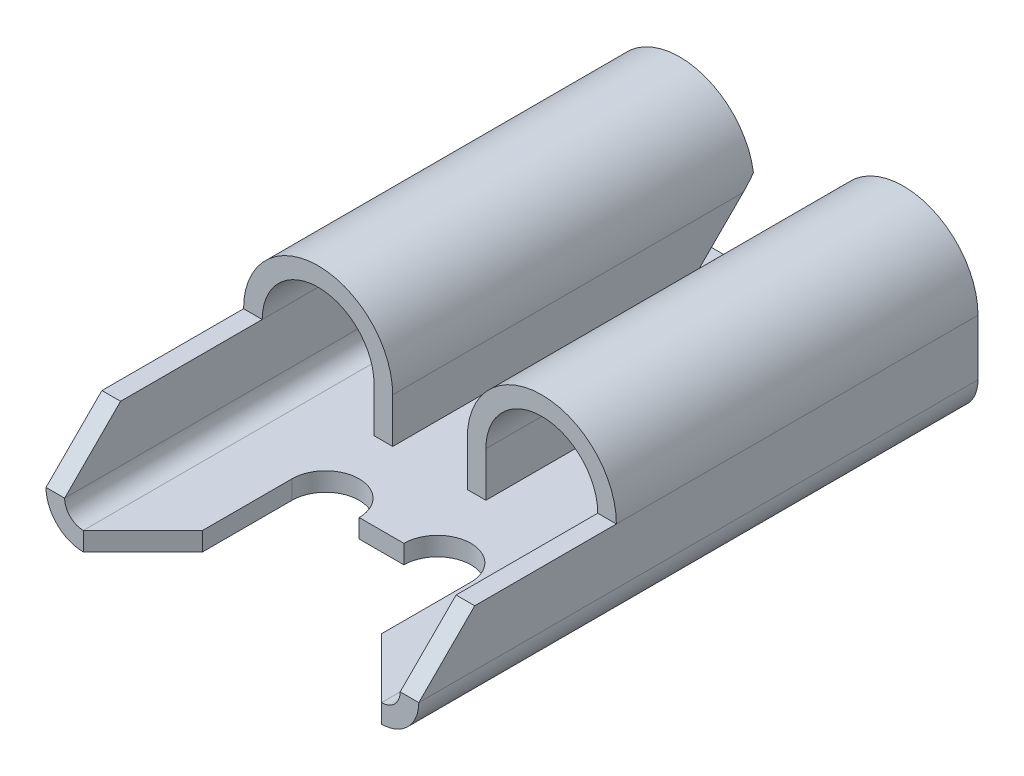
ISO-10303-21;
HEADER;
FILE_DESCRIPTION(('STEP AP214'),'2;1');
FILE_NAME('part.step','',(''),(''),'','','');
FILE_SCHEMA(('AUTOMOTIVE_DESIGN { 1 0 10303 214 1 1 1 1 }'));
ENDSEC;
DATA;
#1=APPLICATION_CONTEXT('core data for automotive mechanical design processes');
#2=APPLICATION_PROTOCOL_DEFINITION('international standard','automotive_design',2000,#1);
#3=PRODUCT_CONTEXT('',#1,'mechanical');
#4=PRODUCT('Part','Part','',(#3));
#5=PRODUCT_RELATED_PRODUCT_CATEGORY('part','',(#4));
#6=PRODUCT_DEFINITION_FORMATION('','',#4);
#7=PRODUCT_DEFINITION_CONTEXT('part definition',#1,'design');
#8=PRODUCT_DEFINITION('design','',#6,#7);
#9=PRODUCT_DEFINITION_SHAPE('','',#8);
#10=(LENGTH_UNIT() NAMED_UNIT(*) SI_UNIT(.MILLI.,.METRE.));
#11=(NAMED_UNIT(*) PLANE_ANGLE_UNIT() SI_UNIT($,.RADIAN.));
#12=(NAMED_UNIT(*) SI_UNIT($,.STERADIAN.) SOLID_ANGLE_UNIT());
#13=UNCERTAINTY_MEASURE_WITH_UNIT(LENGTH_MEASURE(1.E-05),#10,'distance_accuracy_value','');
#14=(GEOMETRIC_REPRESENTATION_CONTEXT(3) GLOBAL_UNCERTAINTY_ASSIGNED_CONTEXT((#13)) GLOBAL_UNIT_ASSIGNED_CONTEXT((#10,
#11,#12)) REPRESENTATION_CONTEXT('',''));
#15=CARTESIAN_POINT('',(0.,0.,0.));
#16=DIRECTION('',(0.,0.,1.));
#17=DIRECTION('',(1.,0.,0.));
#18=AXIS2_PLACEMENT_3D('',#15,#16,#17);
#19=CARTESIAN_POINT('',(-3.,2.5,-15.));
#20=DIRECTION('',(0.,0.,1.));
#21=DIRECTION('',(1.,0.,0.));
#22=AXIS2_PLACEMENT_3D('',#19,#20,#21);
#23=CYLINDRICAL_SURFACE('',#22,2.);
#24=DIRECTION('',(0.,0.,1.));
#25=VECTOR('',#24,1.);
#26=CARTESIAN_POINT('',(-1.,2.5,-15.));
#27=LINE('',#26,#25);
#28=CARTESIAN_POINT('',(-1.,2.5,-14.7));
#29=VERTEX_POINT('',#28);
#30=CARTESIAN_POINT('',(-1.,2.5,-5.3));
#31=VERTEX_POINT('',#30);
#32=EDGE_CURVE('E370',#29,#31,#27,.T.);
#33=ORIENTED_EDGE('',*,*,#32,.F.);
#34=CARTESIAN_POINT('',(-3.,2.5,-14.7));
#35=DIRECTION('',(0.,0.707106781186546,0.707106781186549));
#36=DIRECTION('',(0.,-0.707106781186549,0.707106781186546));
#37=AXIS2_PLACEMENT_3D('',#34,#35,#36);
#38=ELLIPSE('',#37,2.82842712474619,2.);
#39=CARTESIAN_POINT('',(-1.02262800667148,2.8,-15.));
#40=VERTEX_POINT('',#39);
#41=EDGE_CURVE('E438',#29,#40,#38,.T.);
#42=ORIENTED_EDGE('',*,*,#41,.T.);
#43=CARTESIAN_POINT('',(-3.,2.5,-15.));
#44=DIRECTION('',(0.,0.,1.));
#45=DIRECTION('',(1.,0.,0.));
#46=AXIS2_PLACEMENT_3D('',#43,#44,#45);
#47=CIRCLE('',#46,2.);
#48=CARTESIAN_POINT('',(-5.,2.5,-15.));
#49=VERTEX_POINT('',#48);
#50=EDGE_CURVE('E348',#40,#49,#47,.T.);
#51=ORIENTED_EDGE('',*,*,#50,.T.);
#52=DIRECTION('',(0.,0.,1.));
#53=VECTOR('',#52,1.);
#54=CARTESIAN_POINT('',(-5.,2.5,-15.));
#55=LINE('',#54,#53);
#56=CARTESIAN_POINT('',(-5.,2.5,-5.3));
#57=VERTEX_POINT('',#56);
#58=EDGE_CURVE('E367',#49,#57,#55,.T.);
#59=ORIENTED_EDGE('',*,*,#58,.T.);
#60=CARTESIAN_POINT('',(-3.,2.5,-5.3));
#61=DIRECTION('',(0.,0.,1.));
#62=DIRECTION('',(1.,0.,0.));
#63=AXIS2_PLACEMENT_3D('',#60,#61,#62);
#64=CIRCLE('',#63,2.);
#65=EDGE_CURVE('E258',#57,#31,#64,.F.);
#66=ORIENTED_EDGE('',*,*,#65,.T.);
#67=EDGE_LOOP('',(#33,#42,#51,#59,#66));
#68=FACE_BOUND('',#67,.T.);
#69=ADVANCED_FACE('F34',(#68),#23,.T.);
#70=CARTESIAN_POINT('',(-3.,2.5,-15.));
#71=DIRECTION('',(0.,0.,1.));
#72=DIRECTION('',(1.,0.,0.));
#73=AXIS2_PLACEMENT_3D('',#70,#71,#72);
#74=CYLINDRICAL_SURFACE('',#73,1.5);
#75=CARTESIAN_POINT('',(-3.,2.5,-15.));
#76=DIRECTION('',(0.,0.,-1.));
#77=DIRECTION('',(1.,0.,0.));
#78=AXIS2_PLACEMENT_3D('',#75,#76,#77);
#79=CIRCLE('',#78,1.5);
#80=CARTESIAN_POINT('',(-4.5,2.5,-15.));
#81=VERTEX_POINT('',#80);
#82=CARTESIAN_POINT('',(-1.53030615433009,2.8,-15.));
#83=VERTEX_POINT('',#82);
#84=EDGE_CURVE('E346',#81,#83,#79,.T.);
#85=ORIENTED_EDGE('',*,*,#84,.T.);
#86=CARTESIAN_POINT('',(-3.,2.5,-14.7));
#87=DIRECTION('',(0.,0.707106781186546,0.707106781186549));
#88=DIRECTION('',(0.,-0.707106781186549,0.707106781186546));
#89=AXIS2_PLACEMENT_3D('',#86,#87,#88);
#90=ELLIPSE('',#89,2.12132034355964,1.5);
#91=CARTESIAN_POINT('',(-1.5,2.5,-14.7));
#92=VERTEX_POINT('',#91);
#93=EDGE_CURVE('E237',#83,#92,#90,.F.);
#94=ORIENTED_EDGE('',*,*,#93,.T.);
#95=DIRECTION('',(0.,0.,1.));
#96=VECTOR('',#95,1.);
#97=CARTESIAN_POINT('',(-1.5,2.5,-15.));
#98=LINE('',#97,#96);
#99=CARTESIAN_POINT('',(-1.5,2.5,-5.3));
#100=VERTEX_POINT('',#99);
#101=EDGE_CURVE('E229',#92,#100,#98,.T.);
#102=ORIENTED_EDGE('',*,*,#101,.T.);
#103=CARTESIAN_POINT('',(-3.,2.5,-5.3));
#104=DIRECTION('',(0.,0.,1.));
#105=DIRECTION('',(1.,0.,0.));
#106=AXIS2_PLACEMENT_3D('',#103,#104,#105);
#107=CIRCLE('',#106,1.5);
#108=CARTESIAN_POINT('',(-4.5,2.5,-5.3));
#109=VERTEX_POINT('',#108);
#110=EDGE_CURVE('E234',#100,#109,#107,.T.);
#111=ORIENTED_EDGE('',*,*,#110,.T.);
#112=DIRECTION('',(0.,0.,1.));
#113=VECTOR('',#112,1.);
#114=CARTESIAN_POINT('',(-4.5,2.5,-15.));
#115=LINE('',#114,#113);
#116=EDGE_CURVE('E241',#81,#109,#115,.T.);
#117=ORIENTED_EDGE('',*,*,#116,.F.);
#118=EDGE_LOOP('',(#85,#94,#102,#111,#117));
#119=FACE_BOUND('',#118,.T.);
#120=ADVANCED_FACE('F232',(#119),#74,.F.);
#121=CARTESIAN_POINT('',(3.,2.5,-15.));
#122=DIRECTION('',(0.,0.,1.));
#123=DIRECTION('',(1.,0.,0.));
#124=AXIS2_PLACEMENT_3D('',#121,#122,#123);
#125=CYLINDRICAL_SURFACE('',#124,1.5);
#126=DIRECTION('',(0.,0.,1.));
#127=VECTOR('',#126,1.);
#128=CARTESIAN_POINT('',(1.5,2.5,-15.));
#129=LINE('',#128,#127);
#130=CARTESIAN_POINT('',(1.5,2.5,-14.7));
#131=VERTEX_POINT('',#130);
#132=CARTESIAN_POINT('',(1.5,2.5,-5.3));
#133=VERTEX_POINT('',#132);
#134=EDGE_CURVE('E391',#131,#133,#129,.T.);
#135=ORIENTED_EDGE('',*,*,#134,.F.);
#136=CARTESIAN_POINT('',(3.,2.5,-14.7));
#137=DIRECTION('',(0.,0.707106781186546,0.707106781186549));
#138=DIRECTION('',(0.,-0.707106781186549,0.707106781186546));
#139=AXIS2_PLACEMENT_3D('',#136,#137,#138);
#140=ELLIPSE('',#139,2.12132034355964,1.5);
#141=CARTESIAN_POINT('',(1.53030615433009,2.8,-15.));
#142=VERTEX_POINT('',#141);
#143=EDGE_CURVE('E423',#131,#142,#140,.F.);
#144=ORIENTED_EDGE('',*,*,#143,.T.);
#145=CARTESIAN_POINT('',(3.,2.5,-15.));
#146=DIRECTION('',(0.,0.,-1.));
#147=DIRECTION('',(-1.,0.,0.));
#148=AXIS2_PLACEMENT_3D('',#145,#146,#147);
#149=CIRCLE('',#148,1.5);
#150=CARTESIAN_POINT('',(4.5,2.5,-15.));
#151=VERTEX_POINT('',#150);
#152=EDGE_CURVE('E330',#142,#151,#149,.T.);
#153=ORIENTED_EDGE('',*,*,#152,.T.);
#154=DIRECTION('',(0.,0.,1.));
#155=VECTOR('',#154,1.);
#156=CARTESIAN_POINT('',(4.5,2.5,-15.));
#157=LINE('',#156,#155);
#158=CARTESIAN_POINT('',(4.5,2.5,-5.3));
#159=VERTEX_POINT('',#158);
#160=EDGE_CURVE('E388',#151,#159,#157,.T.);
#161=ORIENTED_EDGE('',*,*,#160,.T.);
#162=CARTESIAN_POINT('',(3.,2.5,-5.3));
#163=DIRECTION('',(0.,0.,1.));
#164=DIRECTION('',(1.,0.,0.));
#165=AXIS2_PLACEMENT_3D('',#162,#163,#164);
#166=CIRCLE('',#165,1.5);
#167=EDGE_CURVE('E259',#159,#133,#166,.T.);
#168=ORIENTED_EDGE('',*,*,#167,.T.);
#169=EDGE_LOOP('',(#135,#144,#153,#161,#168));
#170=FACE_BOUND('',#169,.T.);
#171=ADVANCED_FACE('F551',(#170),#125,.F.);
#172=CARTESIAN_POINT('',(3.,2.5,-15.));
#173=DIRECTION('',(0.,0.,1.));
#174=DIRECTION('',(1.,0.,0.));
#175=AXIS2_PLACEMENT_3D('',#172,#173,#174);
#176=CYLINDRICAL_SURFACE('',#175,2.);
#177=CARTESIAN_POINT('',(3.,2.5,-15.));
#178=DIRECTION('',(0.,0.,1.));
#179=DIRECTION('',(-1.,0.,0.));
#180=AXIS2_PLACEMENT_3D('',#177,#178,#179);
#181=CIRCLE('',#180,2.);
#182=CARTESIAN_POINT('',(5.,2.5,-15.));
#183=VERTEX_POINT('',#182);
#184=CARTESIAN_POINT('',(1.02262800667148,2.8,-15.));
#185=VERTEX_POINT('',#184);
#186=EDGE_CURVE('E327',#183,#185,#181,.T.);
#187=ORIENTED_EDGE('',*,*,#186,.T.);
#188=CARTESIAN_POINT('',(3.,2.5,-14.7));
#189=DIRECTION('',(0.,0.707106781186546,0.707106781186549));
#190=DIRECTION('',(0.,-0.707106781186549,0.707106781186546));
#191=AXIS2_PLACEMENT_3D('',#188,#189,#190);
#192=ELLIPSE('',#191,2.82842712474619,2.);
#193=CARTESIAN_POINT('',(1.,2.5,-14.7));
#194=VERTEX_POINT('',#193);
#195=EDGE_CURVE('E429',#185,#194,#192,.T.);
#196=ORIENTED_EDGE('',*,*,#195,.T.);
#197=DIRECTION('',(0.,0.,1.));
#198=VECTOR('',#197,1.);
#199=CARTESIAN_POINT('',(1.,2.5,-15.));
#200=LINE('',#199,#198);
#201=CARTESIAN_POINT('',(1.,2.5,-5.3));
#202=VERTEX_POINT('',#201);
#203=EDGE_CURVE('E397',#194,#202,#200,.T.);
#204=ORIENTED_EDGE('',*,*,#203,.T.);
#205=CARTESIAN_POINT('',(3.,2.5,-5.3));
#206=DIRECTION('',(0.,0.,1.));
#207=DIRECTION('',(1.,0.,0.));
#208=AXIS2_PLACEMENT_3D('',#205,#206,#207);
#209=CIRCLE('',#208,2.);
#210=CARTESIAN_POINT('',(5.,2.5,-5.3));
#211=VERTEX_POINT('',#210);
#212=EDGE_CURVE('E415',#202,#211,#209,.F.);
#213=ORIENTED_EDGE('',*,*,#212,.T.);
#214=DIRECTION('',(0.,0.,1.));
#215=VECTOR('',#214,1.);
#216=CARTESIAN_POINT('',(5.,2.5,-15.));
#217=LINE('',#216,#215);
#218=EDGE_CURVE('E399',#183,#211,#217,.T.);
#219=ORIENTED_EDGE('',*,*,#218,.F.);
#220=EDGE_LOOP('',(#187,#196,#204,#213,#219));
#221=FACE_BOUND('',#220,.T.);
#222=ADVANCED_FACE('F584',(#221),#176,.T.);
#223=CARTESIAN_POINT('',(-4.,0.999999999999999,0.));
#224=DIRECTION('',(0.,0.,-1.));
#225=DIRECTION('',(-1.,0.,0.));
#226=AXIS2_PLACEMENT_3D('',#223,#224,#225);
#227=PLANE('',#226);
#228=CARTESIAN_POINT('',(4.,0.999999999999999,0.));
#229=DIRECTION('',(0.,0.,1.));
#230=DIRECTION('',(1.,0.,0.));
#231=AXIS2_PLACEMENT_3D('',#228,#229,#230);
#232=CIRCLE('',#231,1.);
#233=CARTESIAN_POINT('',(4.,0.,0.));
#234=VERTEX_POINT('',#233);
#235=CARTESIAN_POINT('',(5.,1.00000000000001,0.));
#236=VERTEX_POINT('',#235);
#237=EDGE_CURVE('E356',#234,#236,#232,.T.);
#238=ORIENTED_EDGE('',*,*,#237,.T.);
#239=DIRECTION('',(-1.,0.,0.));
#240=VECTOR('',#239,1.);
#241=CARTESIAN_POINT('',(-4.,1.,0.));
#242=LINE('',#241,#240);
#243=CARTESIAN_POINT('',(4.5,1.,0.));
#244=VERTEX_POINT('',#243);
#245=EDGE_CURVE('E443',#236,#244,#242,.T.);
#246=ORIENTED_EDGE('',*,*,#245,.T.);
#247=CARTESIAN_POINT('',(4.,0.999999999999999,0.));
#248=DIRECTION('',(0.,0.,-1.));
#249=DIRECTION('',(1.,0.,0.));
#250=AXIS2_PLACEMENT_3D('',#247,#248,#249);
#251=CIRCLE('',#250,0.5);
#252=CARTESIAN_POINT('',(4.,0.5,0.));
#253=VERTEX_POINT('',#252);
#254=EDGE_CURVE('E359',#244,#253,#251,.T.);
#255=ORIENTED_EDGE('',*,*,#254,.T.);
#256=DIRECTION('',(0.,-1.,0.));
#257=VECTOR('',#256,1.);
#258=CARTESIAN_POINT('',(4.,0.999999999999998,0.));
#259=LINE('',#258,#257);
#260=EDGE_CURVE('E412',#253,#234,#259,.T.);
#261=ORIENTED_EDGE('',*,*,#260,.T.);
#262=EDGE_LOOP('',(#238,#246,#255,#261));
#263=FACE_BOUND('',#262,.T.);
#264=ADVANCED_FACE('F491',(#263),#227,.F.);
#265=CARTESIAN_POINT('',(-4.,0.999999999999999,-15.));
#266=DIRECTION('',(0.,0.,1.));
#267=DIRECTION('',(1.,0.,0.));
#268=AXIS2_PLACEMENT_3D('',#265,#266,#267);
#269=CYLINDRICAL_SURFACE('',#268,1.);
#270=CARTESIAN_POINT('',(-4.,0.999999999999999,0.));
#271=DIRECTION('',(0.,0.,1.));
#272=DIRECTION('',(-1.,0.,0.));
#273=AXIS2_PLACEMENT_3D('',#270,#271,#272);
#274=CIRCLE('',#273,1.);
#275=CARTESIAN_POINT('',(-5.,1.00000000000001,0.));
#276=VERTEX_POINT('',#275);
#277=CARTESIAN_POINT('',(-4.,0.,0.));
#278=VERTEX_POINT('',#277);
#279=EDGE_CURVE('E314',#276,#278,#274,.T.);
#280=ORIENTED_EDGE('',*,*,#279,.F.);
#281=DIRECTION('',(0.,0.,1.));
#282=VECTOR('',#281,1.);
#283=CARTESIAN_POINT('',(-5.,1.00000000000001,-15.));
#284=LINE('',#283,#282);
#285=CARTESIAN_POINT('',(-5.,1.00000000000001,-15.));
#286=VERTEX_POINT('',#285);
#287=EDGE_CURVE('E364',#286,#276,#284,.T.);
#288=ORIENTED_EDGE('',*,*,#287,.F.);
#289=CARTESIAN_POINT('',(-4.,0.999999999999999,-15.));
#290=DIRECTION('',(0.,0.,1.));
#291=DIRECTION('',(-1.,0.,0.));
#292=AXIS2_PLACEMENT_3D('',#289,#290,#291);
#293=CIRCLE('',#292,1.);
#294=CARTESIAN_POINT('',(-3.99999999999999,0.,-15.));
#295=VERTEX_POINT('',#294);
#296=EDGE_CURVE('E315',#286,#295,#293,.T.);
#297=ORIENTED_EDGE('',*,*,#296,.T.);
#298=DIRECTION('',(0.,0.,1.));
#299=VECTOR('',#298,1.);
#300=CARTESIAN_POINT('',(-3.99999999999999,0.,-15.));
#301=LINE('',#300,#299);
#302=EDGE_CURVE('E353',#295,#278,#301,.T.);
#303=ORIENTED_EDGE('',*,*,#302,.T.);
#304=EDGE_LOOP('',(#280,#288,#297,#303));
#305=FACE_BOUND('',#304,.T.);
#306=ADVANCED_FACE('F467',(#305),#269,.T.);
#307=CARTESIAN_POINT('',(-5.,1.00000000000001,-15.));
#308=DIRECTION('',(-1.,0.,0.));
#309=DIRECTION('',(0.,0.,1.));
#310=AXIS2_PLACEMENT_3D('',#307,#308,#309);
#311=PLANE('',#310);
#312=ORIENTED_EDGE('',*,*,#287,.T.);
#313=DIRECTION('',(0.,-0.707106781186546,0.707106781186549));
#314=VECTOR('',#313,1.);
#315=CARTESIAN_POINT('',(-5.,8.5,-7.50000000000003));
#316=LINE('',#315,#314);
#317=CARTESIAN_POINT('',(-5.,2.5,-1.50000000000001));
#318=VERTEX_POINT('',#317);
#319=EDGE_CURVE('E56',#276,#318,#316,.F.);
#320=ORIENTED_EDGE('',*,*,#319,.T.);
#321=DIRECTION('',(0.,0.,-1.));
#322=VECTOR('',#321,1.);
#323=CARTESIAN_POINT('',(-5.,2.5,0.));
#324=LINE('',#323,#322);
#325=EDGE_CURVE('E647',#318,#57,#324,.T.);
#326=ORIENTED_EDGE('',*,*,#325,.T.);
#327=ORIENTED_EDGE('',*,*,#58,.F.);
#328=DIRECTION('',(0.,-1.,0.));
#329=VECTOR('',#328,1.);
#330=CARTESIAN_POINT('',(-5.,1.00000000000001,-15.));
#331=LINE('',#330,#329);
#332=EDGE_CURVE('E350',#49,#286,#331,.T.);
#333=ORIENTED_EDGE('',*,*,#332,.T.);
#334=EDGE_LOOP('',(#312,#320,#326,#327,#333));
#335=FACE_BOUND('',#334,.T.);
#336=ADVANCED_FACE('F462',(#335),#311,.T.);
#337=CARTESIAN_POINT('',(-1.,2.5,-15.));
#338=DIRECTION('',(1.,0.,0.));
#339=DIRECTION('',(0.,1.,0.));
#340=AXIS2_PLACEMENT_3D('',#337,#338,#339);
#341=PLANE('',#340);
#342=DIRECTION('',(0.,0.,1.));
#343=VECTOR('',#342,1.);
#344=CARTESIAN_POINT('',(-1.,1.3,-15.));
#345=LINE('',#344,#343);
#346=CARTESIAN_POINT('',(-1.,1.3,-13.5));
#347=VERTEX_POINT('',#346);
#348=CARTESIAN_POINT('',(-1.,1.3,-5.3));
#349=VERTEX_POINT('',#348);
#350=EDGE_CURVE('E372',#347,#349,#345,.T.);
#351=ORIENTED_EDGE('',*,*,#350,.F.);
#352=DIRECTION('',(0.,-0.707106781186549,0.707106781186546));
#353=VECTOR('',#352,1.);
#354=CARTESIAN_POINT('',(-1.,2.65,-14.85));
#355=LINE('',#354,#353);
#356=EDGE_CURVE('E436',#347,#29,#355,.F.);
#357=ORIENTED_EDGE('',*,*,#356,.T.);
#358=ORIENTED_EDGE('',*,*,#32,.T.);
#359=DIRECTION('',(0.,1.,0.));
#360=VECTOR('',#359,1.);
#361=CARTESIAN_POINT('',(-1.,2.5,-5.3));
#362=LINE('',#361,#360);
#363=EDGE_CURVE('E644',#349,#31,#362,.T.);
#364=ORIENTED_EDGE('',*,*,#363,.F.);
#365=EDGE_LOOP('',(#351,#357,#358,#364));
#366=FACE_BOUND('',#365,.T.);
#367=ADVANCED_FACE('F557',(#366),#341,.T.);
#368=CARTESIAN_POINT('',(-1.5,1.3,-15.));
#369=DIRECTION('',(0.,-1.,0.));
#370=DIRECTION('',(0.,0.,-1.));
#371=AXIS2_PLACEMENT_3D('',#368,#369,#370);
#372=PLANE('',#371);
#373=DIRECTION('',(0.,0.,1.));
#374=VECTOR('',#373,1.);
#375=CARTESIAN_POINT('',(-1.5,1.3,-15.));
#376=LINE('',#375,#374);
#377=CARTESIAN_POINT('',(-1.5,1.3,-13.5));
#378=VERTEX_POINT('',#377);
#379=CARTESIAN_POINT('',(-1.5,1.3,-5.3));
#380=VERTEX_POINT('',#379);
#381=EDGE_CURVE('E240',#378,#380,#376,.T.);
#382=ORIENTED_EDGE('',*,*,#381,.F.);
#383=DIRECTION('',(1.,0.,0.));
#384=VECTOR('',#383,1.);
#385=CARTESIAN_POINT('',(-1.5,1.3,-13.5));
#386=LINE('',#385,#384);
#387=EDGE_CURVE('E433',#378,#347,#386,.T.);
#388=ORIENTED_EDGE('',*,*,#387,.T.);
#389=ORIENTED_EDGE('',*,*,#350,.T.);
#390=DIRECTION('',(1.,0.,0.));
#391=VECTOR('',#390,1.);
#392=CARTESIAN_POINT('',(-1.5,1.3,-5.3));
#393=LINE('',#392,#391);
#394=EDGE_CURVE('E641',#380,#349,#393,.T.);
#395=ORIENTED_EDGE('',*,*,#394,.F.);
#396=EDGE_LOOP('',(#382,#388,#389,#395));
#397=FACE_BOUND('',#396,.T.);
#398=ADVANCED_FACE('F560',(#397),#372,.T.);
#399=CARTESIAN_POINT('',(-1.5,2.5,-15.));
#400=DIRECTION('',(-1.,0.,0.));
#401=DIRECTION('',(0.,-1.,0.));
#402=AXIS2_PLACEMENT_3D('',#399,#400,#401);
#403=PLANE('',#402);
#404=ORIENTED_EDGE('',*,*,#101,.F.);
#405=DIRECTION('',(0.,0.707106781186549,-0.707106781186546));
#406=VECTOR('',#405,1.);
#407=CARTESIAN_POINT('',(-1.5,2.65,-14.85));
#408=LINE('',#407,#406);
#409=EDGE_CURVE('E441',#92,#378,#408,.F.);
#410=ORIENTED_EDGE('',*,*,#409,.T.);
#411=ORIENTED_EDGE('',*,*,#381,.T.);
#412=DIRECTION('',(0.,1.,0.));
#413=VECTOR('',#412,1.);
#414=CARTESIAN_POINT('',(-1.5,-2.60888091114368,-5.3));
#415=LINE('',#414,#413);
#416=EDGE_CURVE('E244',#380,#100,#415,.T.);
#417=ORIENTED_EDGE('',*,*,#416,.T.);
#418=EDGE_LOOP('',(#404,#410,#411,#417));
#419=FACE_BOUND('',#418,.T.);
#420=ADVANCED_FACE('F245',(#419),#403,.T.);
#421=CARTESIAN_POINT('',(-4.5,1.,-15.));
#422=DIRECTION('',(1.,0.,0.));
#423=DIRECTION('',(0.,0.,-1.));
#424=AXIS2_PLACEMENT_3D('',#421,#422,#423);
#425=PLANE('',#424);
#426=DIRECTION('',(0.,0.,-1.));
#427=VECTOR('',#426,1.);
#428=CARTESIAN_POINT('',(-4.5,2.5,-15.));
#429=LINE('',#428,#427);
#430=CARTESIAN_POINT('',(-4.5,2.5,-1.5));
#431=VERTEX_POINT('',#430);
#432=EDGE_CURVE('E265',#431,#109,#429,.T.);
#433=ORIENTED_EDGE('',*,*,#432,.F.);
#434=DIRECTION('',(0.,0.707106781186546,-0.707106781186549));
#435=VECTOR('',#434,1.);
#436=CARTESIAN_POINT('',(-4.5,8.5,-7.50000000000003));
#437=LINE('',#436,#435);
#438=CARTESIAN_POINT('',(-4.5,1.,0.));
#439=VERTEX_POINT('',#438);
#440=EDGE_CURVE('E11',#431,#439,#437,.F.);
#441=ORIENTED_EDGE('',*,*,#440,.T.);
#442=DIRECTION('',(0.,0.,1.));
#443=VECTOR('',#442,1.);
#444=CARTESIAN_POINT('',(-4.5,1.,-15.));
#445=LINE('',#444,#443);
#446=CARTESIAN_POINT('',(-4.5,1.,-15.));
#447=VERTEX_POINT('',#446);
#448=EDGE_CURVE('E376',#447,#439,#445,.T.);
#449=ORIENTED_EDGE('',*,*,#448,.F.);
#450=DIRECTION('',(0.,1.,0.));
#451=VECTOR('',#450,1.);
#452=CARTESIAN_POINT('',(-4.5,1.,-15.));
#453=LINE('',#452,#451);
#454=EDGE_CURVE('E343',#447,#81,#453,.T.);
#455=ORIENTED_EDGE('',*,*,#454,.T.);
#456=ORIENTED_EDGE('',*,*,#116,.T.);
#457=EDGE_LOOP('',(#433,#441,#449,#455,#456));
#458=FACE_BOUND('',#457,.T.);
#459=ADVANCED_FACE('F566',(#458),#425,.T.);
#460=CARTESIAN_POINT('',(-4.,0.999999999999999,-15.));
#461=DIRECTION('',(0.,0.,1.));
#462=DIRECTION('',(1.,0.,0.));
#463=AXIS2_PLACEMENT_3D('',#460,#461,#462);
#464=CYLINDRICAL_SURFACE('',#463,0.5);
#465=CARTESIAN_POINT('',(-4.,0.999999999999999,0.));
#466=DIRECTION('',(0.,0.,-1.));
#467=DIRECTION('',(-1.,0.,0.));
#468=AXIS2_PLACEMENT_3D('',#465,#466,#467);
#469=CIRCLE('',#468,0.5);
#470=CARTESIAN_POINT('',(-3.99999999999999,0.5,0.));
#471=VERTEX_POINT('',#470);
#472=EDGE_CURVE('E319',#471,#439,#469,.T.);
#473=ORIENTED_EDGE('',*,*,#472,.F.);
#474=DIRECTION('',(0.,0.,1.));
#475=VECTOR('',#474,1.);
#476=CARTESIAN_POINT('',(-3.99999999999999,0.5,-15.));
#477=LINE('',#476,#475);
#478=CARTESIAN_POINT('',(-3.99999999999999,0.5,-15.));
#479=VERTEX_POINT('',#478);
#480=EDGE_CURVE('E379',#479,#471,#477,.T.);
#481=ORIENTED_EDGE('',*,*,#480,.F.);
#482=CARTESIAN_POINT('',(-4.,0.999999999999999,-15.));
#483=DIRECTION('',(0.,0.,-1.));
#484=DIRECTION('',(-1.,0.,0.));
#485=AXIS2_PLACEMENT_3D('',#482,#483,#484);
#486=CIRCLE('',#485,0.5);
#487=EDGE_CURVE('E340',#479,#447,#486,.T.);
#488=ORIENTED_EDGE('',*,*,#487,.T.);
#489=ORIENTED_EDGE('',*,*,#448,.T.);
#490=EDGE_LOOP('',(#473,#481,#488,#489));
#491=FACE_BOUND('',#490,.T.);
#492=ADVANCED_FACE('F508',(#491),#464,.F.);
#493=CARTESIAN_POINT('',(0.,0.5,-15.));
#494=DIRECTION('',(0.,1.,0.));
#495=DIRECTION('',(0.,0.,1.));
#496=AXIS2_PLACEMENT_3D('',#493,#494,#495);
#497=PLANE('',#496);
#498=DIRECTION('',(0.,0.,1.));
#499=VECTOR('',#498,1.);
#500=CARTESIAN_POINT('',(-2.4,0.5,-15.));
#501=LINE('',#500,#499);
#502=CARTESIAN_POINT('',(-2.4,0.5,-4.));
#503=VERTEX_POINT('',#502);
#504=CARTESIAN_POINT('',(-2.4,0.5,-1.59999999999999));
#505=VERTEX_POINT('',#504);
#506=EDGE_CURVE('E304',#503,#505,#501,.T.);
#507=ORIENTED_EDGE('',*,*,#506,.F.);
#508=CARTESIAN_POINT('',(-1.5,0.5,-4.));
#509=DIRECTION('',(0.,1.,0.));
#510=DIRECTION('',(0.,0.,1.));
#511=AXIS2_PLACEMENT_3D('',#508,#509,#510);
#512=CIRCLE('',#511,0.9);
#513=CARTESIAN_POINT('',(-0.599999999999999,0.5,-4.));
#514=VERTEX_POINT('',#513);
#515=EDGE_CURVE('E306',#514,#503,#512,.T.);
#516=ORIENTED_EDGE('',*,*,#515,.F.);
#517=DIRECTION('',(-1.,0.,0.));
#518=VECTOR('',#517,1.);
#519=CARTESIAN_POINT('',(0.,0.5,-4.));
#520=LINE('',#519,#518);
#521=CARTESIAN_POINT('',(0.600000000000001,0.5,-4.));
#522=VERTEX_POINT('',#521);
#523=EDGE_CURVE('E308',#522,#514,#520,.T.);
#524=ORIENTED_EDGE('',*,*,#523,.F.);
#525=CARTESIAN_POINT('',(1.5,0.5,-4.));
#526=DIRECTION('',(0.,1.,0.));
#527=DIRECTION('',(0.,0.,1.));
#528=AXIS2_PLACEMENT_3D('',#525,#526,#527);
#529=CIRCLE('',#528,0.9);
#530=CARTESIAN_POINT('',(2.4,0.5,-4.));
#531=VERTEX_POINT('',#530);
#532=EDGE_CURVE('E310',#531,#522,#529,.T.);
#533=ORIENTED_EDGE('',*,*,#532,.F.);
#534=DIRECTION('',(0.,0.,-1.));
#535=VECTOR('',#534,1.);
#536=CARTESIAN_POINT('',(2.4,0.5,-15.));
#537=LINE('',#536,#535);
#538=CARTESIAN_POINT('',(2.4,0.5,-1.59999999999999));
#539=VERTEX_POINT('',#538);
#540=EDGE_CURVE('E312',#539,#531,#537,.T.);
#541=ORIENTED_EDGE('',*,*,#540,.F.);
#542=DIRECTION('',(-0.707106781186549,0.,-0.707106781186546));
#543=VECTOR('',#542,1.);
#544=CARTESIAN_POINT('',(-5.50000000000001,0.5,-9.49999999999998));
#545=LINE('',#544,#543);
#546=EDGE_CURVE('E302',#253,#539,#545,.T.);
#547=ORIENTED_EDGE('',*,*,#546,.F.);
#548=DIRECTION('',(0.,0.,1.));
#549=VECTOR('',#548,1.);
#550=CARTESIAN_POINT('',(3.99999999999999,0.499999999999999,-15.));
#551=LINE('',#550,#549);
#552=CARTESIAN_POINT('',(3.99999999999999,0.499999999999999,-15.));
#553=VERTEX_POINT('',#552);
#554=EDGE_CURVE('E382',#553,#253,#551,.T.);
#555=ORIENTED_EDGE('',*,*,#554,.F.);
#556=DIRECTION('',(-1.,0.,0.));
#557=VECTOR('',#556,1.);
#558=CARTESIAN_POINT('',(0.,0.5,-15.));
#559=LINE('',#558,#557);
#560=EDGE_CURVE('E338',#553,#479,#559,.T.);
#561=ORIENTED_EDGE('',*,*,#560,.T.);
#562=ORIENTED_EDGE('',*,*,#480,.T.);
#563=DIRECTION('',(-0.707106781186549,0.,0.707106781186546));
#564=VECTOR('',#563,1.);
#565=CARTESIAN_POINT('',(5.50000000000001,0.5,-9.49999999999997));
#566=LINE('',#565,#564);
#567=EDGE_CURVE('E291',#505,#471,#566,.T.);
#568=ORIENTED_EDGE('',*,*,#567,.F.);
#569=EDGE_LOOP('',(#507,#516,#524,#533,#541,#547,#555,#561,#562,#568));
#570=FACE_BOUND('',#569,.T.);
#571=ADVANCED_FACE('F500',(#570),#497,.T.);
#572=CARTESIAN_POINT('',(4.,0.999999999999999,-15.));
#573=DIRECTION('',(0.,0.,1.));
#574=DIRECTION('',(1.,0.,0.));
#575=AXIS2_PLACEMENT_3D('',#572,#573,#574);
#576=CYLINDRICAL_SURFACE('',#575,0.5);
#577=ORIENTED_EDGE('',*,*,#254,.F.);
#578=DIRECTION('',(0.,0.,1.));
#579=VECTOR('',#578,1.);
#580=CARTESIAN_POINT('',(4.5,1.,-15.));
#581=LINE('',#580,#579);
#582=CARTESIAN_POINT('',(4.5,1.,-15.));
#583=VERTEX_POINT('',#582);
#584=EDGE_CURVE('E385',#583,#244,#581,.T.);
#585=ORIENTED_EDGE('',*,*,#584,.F.);
#586=CARTESIAN_POINT('',(4.,0.999999999999999,-15.));
#587=DIRECTION('',(0.,0.,-1.));
#588=DIRECTION('',(1.,0.,0.));
#589=AXIS2_PLACEMENT_3D('',#586,#587,#588);
#590=CIRCLE('',#589,0.5);
#591=EDGE_CURVE('E335',#583,#553,#590,.T.);
#592=ORIENTED_EDGE('',*,*,#591,.T.);
#593=ORIENTED_EDGE('',*,*,#554,.T.);
#594=EDGE_LOOP('',(#577,#585,#592,#593));
#595=FACE_BOUND('',#594,.T.);
#596=ADVANCED_FACE('F495',(#595),#576,.F.);
#597=CARTESIAN_POINT('',(4.5,1.,-15.));
#598=DIRECTION('',(-1.,0.,0.));
#599=DIRECTION('',(0.,0.,1.));
#600=AXIS2_PLACEMENT_3D('',#597,#598,#599);
#601=PLANE('',#600);
#602=ORIENTED_EDGE('',*,*,#584,.T.);
#603=DIRECTION('',(0.,-0.707106781186546,0.707106781186549));
#604=VECTOR('',#603,1.);
#605=CARTESIAN_POINT('',(4.5,8.5,-7.50000000000003));
#606=LINE('',#605,#604);
#607=CARTESIAN_POINT('',(4.5,2.5,-1.5));
#608=VERTEX_POINT('',#607);
#609=EDGE_CURVE('E446',#244,#608,#606,.F.);
#610=ORIENTED_EDGE('',*,*,#609,.T.);
#611=DIRECTION('',(0.,0.,1.));
#612=VECTOR('',#611,1.);
#613=CARTESIAN_POINT('',(4.5,2.5,-15.));
#614=LINE('',#613,#612);
#615=EDGE_CURVE('E629',#159,#608,#614,.T.);
#616=ORIENTED_EDGE('',*,*,#615,.F.);
#617=ORIENTED_EDGE('',*,*,#160,.F.);
#618=DIRECTION('',(0.,-1.,0.));
#619=VECTOR('',#618,1.);
#620=CARTESIAN_POINT('',(4.5,1.,-15.));
#621=LINE('',#620,#619);
#622=EDGE_CURVE('E332',#151,#583,#621,.T.);
#623=ORIENTED_EDGE('',*,*,#622,.T.);
#624=EDGE_LOOP('',(#602,#610,#616,#617,#623));
#625=FACE_BOUND('',#624,.T.);
#626=ADVANCED_FACE('F577',(#625),#601,.T.);
#627=CARTESIAN_POINT('',(1.5,2.5,-15.));
#628=DIRECTION('',(1.,0.,0.));
#629=DIRECTION('',(0.,0.,-1.));
#630=AXIS2_PLACEMENT_3D('',#627,#628,#629);
#631=PLANE('',#630);
#632=DIRECTION('',(0.,0.,1.));
#633=VECTOR('',#632,1.);
#634=CARTESIAN_POINT('',(1.5,1.3,-15.));
#635=LINE('',#634,#633);
#636=CARTESIAN_POINT('',(1.5,1.3,-13.5));
#637=VERTEX_POINT('',#636);
#638=CARTESIAN_POINT('',(1.5,1.3,-5.3));
#639=VERTEX_POINT('',#638);
#640=EDGE_CURVE('E393',#637,#639,#635,.T.);
#641=ORIENTED_EDGE('',*,*,#640,.F.);
#642=DIRECTION('',(0.,-0.707106781186549,0.707106781186546));
#643=VECTOR('',#642,1.);
#644=CARTESIAN_POINT('',(1.5,2.65,-14.85));
#645=LINE('',#644,#643);
#646=EDGE_CURVE('E421',#637,#131,#645,.F.);
#647=ORIENTED_EDGE('',*,*,#646,.T.);
#648=ORIENTED_EDGE('',*,*,#134,.T.);
#649=DIRECTION('',(0.,1.,0.));
#650=VECTOR('',#649,1.);
#651=CARTESIAN_POINT('',(1.5,-2.60888091114368,-5.3));
#652=LINE('',#651,#650);
#653=EDGE_CURVE('E251',#639,#133,#652,.T.);
#654=ORIENTED_EDGE('',*,*,#653,.F.);
#655=EDGE_LOOP('',(#641,#647,#648,#654));
#656=FACE_BOUND('',#655,.T.);
#657=ADVANCED_FACE('F580',(#656),#631,.T.);
#658=CARTESIAN_POINT('',(1.5,1.3,-15.));
#659=DIRECTION('',(0.,-1.,0.));
#660=DIRECTION('',(0.,0.,-1.));
#661=AXIS2_PLACEMENT_3D('',#658,#659,#660);
#662=PLANE('',#661);
#663=DIRECTION('',(0.,0.,1.));
#664=VECTOR('',#663,1.);
#665=CARTESIAN_POINT('',(1.,1.3,-15.));
#666=LINE('',#665,#664);
#667=CARTESIAN_POINT('',(1.,1.3,-13.5));
#668=VERTEX_POINT('',#667);
#669=CARTESIAN_POINT('',(1.,1.3,-5.3));
#670=VERTEX_POINT('',#669);
#671=EDGE_CURVE('E395',#668,#670,#666,.T.);
#672=ORIENTED_EDGE('',*,*,#671,.F.);
#673=DIRECTION('',(1.,0.,0.));
#674=VECTOR('',#673,1.);
#675=CARTESIAN_POINT('',(1.5,1.3,-13.5));
#676=LINE('',#675,#674);
#677=EDGE_CURVE('E418',#668,#637,#676,.T.);
#678=ORIENTED_EDGE('',*,*,#677,.T.);
#679=ORIENTED_EDGE('',*,*,#640,.T.);
#680=DIRECTION('',(1.,0.,0.));
#681=VECTOR('',#680,1.);
#682=CARTESIAN_POINT('',(1.5,1.3,-5.3));
#683=LINE('',#682,#681);
#684=EDGE_CURVE('E645',#670,#639,#683,.T.);
#685=ORIENTED_EDGE('',*,*,#684,.F.);
#686=EDGE_LOOP('',(#672,#678,#679,#685));
#687=FACE_BOUND('',#686,.T.);
#688=ADVANCED_FACE('F588',(#687),#662,.T.);
#689=CARTESIAN_POINT('',(1.,2.5,-15.));
#690=DIRECTION('',(-1.,0.,0.));
#691=DIRECTION('',(0.,-1.,0.));
#692=AXIS2_PLACEMENT_3D('',#689,#690,#691);
#693=PLANE('',#692);
#694=ORIENTED_EDGE('',*,*,#203,.F.);
#695=DIRECTION('',(0.,0.707106781186549,-0.707106781186546));
#696=VECTOR('',#695,1.);
#697=CARTESIAN_POINT('',(1.,2.65,-14.85));
#698=LINE('',#697,#696);
#699=EDGE_CURVE('E431',#194,#668,#698,.F.);
#700=ORIENTED_EDGE('',*,*,#699,.T.);
#701=ORIENTED_EDGE('',*,*,#671,.T.);
#702=DIRECTION('',(0.,-1.,0.));
#703=VECTOR('',#702,1.);
#704=CARTESIAN_POINT('',(1.,2.5,-5.3));
#705=LINE('',#704,#703);
#706=EDGE_CURVE('E250',#202,#670,#705,.T.);
#707=ORIENTED_EDGE('',*,*,#706,.F.);
#708=EDGE_LOOP('',(#694,#700,#701,#707));
#709=FACE_BOUND('',#708,.T.);
#710=ADVANCED_FACE('F592',(#709),#693,.T.);
#711=CARTESIAN_POINT('',(5.,1.00000000000001,-15.));
#712=DIRECTION('',(1.,0.,0.));
#713=DIRECTION('',(0.,0.,-1.));
#714=AXIS2_PLACEMENT_3D('',#711,#712,#713);
#715=PLANE('',#714);
#716=DIRECTION('',(0.,0.,1.));
#717=VECTOR('',#716,1.);
#718=CARTESIAN_POINT('',(5.,2.5,0.));
#719=LINE('',#718,#717);
#720=CARTESIAN_POINT('',(5.,2.5,-1.5));
#721=VERTEX_POINT('',#720);
#722=EDGE_CURVE('E627',#211,#721,#719,.T.);
#723=ORIENTED_EDGE('',*,*,#722,.T.);
#724=DIRECTION('',(0.,0.707106781186546,-0.707106781186549));
#725=VECTOR('',#724,1.);
#726=CARTESIAN_POINT('',(5.,8.5,-7.50000000000003));
#727=LINE('',#726,#725);
#728=EDGE_CURVE('E450',#721,#236,#727,.F.);
#729=ORIENTED_EDGE('',*,*,#728,.T.);
#730=DIRECTION('',(0.,0.,1.));
#731=VECTOR('',#730,1.);
#732=CARTESIAN_POINT('',(5.,1.00000000000001,-15.));
#733=LINE('',#732,#731);
#734=CARTESIAN_POINT('',(5.,1.00000000000001,-15.));
#735=VERTEX_POINT('',#734);
#736=EDGE_CURVE('E402',#735,#236,#733,.T.);
#737=ORIENTED_EDGE('',*,*,#736,.F.);
#738=DIRECTION('',(0.,1.,0.));
#739=VECTOR('',#738,1.);
#740=CARTESIAN_POINT('',(5.,1.00000000000001,-15.));
#741=LINE('',#740,#739);
#742=EDGE_CURVE('E324',#735,#183,#741,.T.);
#743=ORIENTED_EDGE('',*,*,#742,.T.);
#744=ORIENTED_EDGE('',*,*,#218,.T.);
#745=EDGE_LOOP('',(#723,#729,#737,#743,#744));
#746=FACE_BOUND('',#745,.T.);
#747=ADVANCED_FACE('F596',(#746),#715,.T.);
#748=CARTESIAN_POINT('',(4.,0.999999999999999,-15.));
#749=DIRECTION('',(0.,0.,1.));
#750=DIRECTION('',(1.,0.,0.));
#751=AXIS2_PLACEMENT_3D('',#748,#749,#750);
#752=CYLINDRICAL_SURFACE('',#751,1.);
#753=ORIENTED_EDGE('',*,*,#237,.F.);
#754=DIRECTION('',(0.,0.,1.));
#755=VECTOR('',#754,1.);
#756=CARTESIAN_POINT('',(3.99999999999999,0.,-15.));
#757=LINE('',#756,#755);
#758=CARTESIAN_POINT('',(3.99999999999999,0.,-15.));
#759=VERTEX_POINT('',#758);
#760=EDGE_CURVE('E405',#759,#234,#757,.T.);
#761=ORIENTED_EDGE('',*,*,#760,.F.);
#762=CARTESIAN_POINT('',(4.,0.999999999999999,-15.));
#763=DIRECTION('',(0.,0.,1.));
#764=DIRECTION('',(1.,0.,0.));
#765=AXIS2_PLACEMENT_3D('',#762,#763,#764);
#766=CIRCLE('',#765,1.);
#767=EDGE_CURVE('E321',#759,#735,#766,.T.);
#768=ORIENTED_EDGE('',*,*,#767,.T.);
#769=ORIENTED_EDGE('',*,*,#736,.T.);
#770=EDGE_LOOP('',(#753,#761,#768,#769));
#771=FACE_BOUND('',#770,.T.);
#772=ADVANCED_FACE('F483',(#771),#752,.T.);
#773=CARTESIAN_POINT('',(0.,0.,-15.));
#774=DIRECTION('',(0.,-1.,0.));
#775=DIRECTION('',(1.,0.,0.));
#776=AXIS2_PLACEMENT_3D('',#773,#774,#775);
#777=PLANE('',#776);
#778=DIRECTION('',(0.707106781186549,0.,0.707106781186546));
#779=VECTOR('',#778,1.);
#780=CARTESIAN_POINT('',(4.,0.,0.));
#781=LINE('',#780,#779);
#782=CARTESIAN_POINT('',(2.4,0.,-1.59999999999999));
#783=VERTEX_POINT('',#782);
#784=EDGE_CURVE('E286',#783,#234,#781,.T.);
#785=ORIENTED_EDGE('',*,*,#784,.F.);
#786=DIRECTION('',(0.,0.,1.));
#787=VECTOR('',#786,1.);
#788=CARTESIAN_POINT('',(2.4,0.,-1.59999999999999));
#789=LINE('',#788,#787);
#790=CARTESIAN_POINT('',(2.4,0.,-4.));
#791=VERTEX_POINT('',#790);
#792=EDGE_CURVE('E283',#791,#783,#789,.T.);
#793=ORIENTED_EDGE('',*,*,#792,.F.);
#794=CARTESIAN_POINT('',(1.5,0.,-4.));
#795=DIRECTION('',(0.,-1.,0.));
#796=DIRECTION('',(-1.,0.,0.));
#797=AXIS2_PLACEMENT_3D('',#794,#795,#796);
#798=CIRCLE('',#797,0.9);
#799=CARTESIAN_POINT('',(0.600000000000001,0.,-4.));
#800=VERTEX_POINT('',#799);
#801=EDGE_CURVE('E280',#800,#791,#798,.T.);
#802=ORIENTED_EDGE('',*,*,#801,.F.);
#803=DIRECTION('',(1.,0.,0.));
#804=VECTOR('',#803,1.);
#805=CARTESIAN_POINT('',(-0.6,0.,-4.));
#806=LINE('',#805,#804);
#807=CARTESIAN_POINT('',(-0.599999999999999,0.,-4.));
#808=VERTEX_POINT('',#807);
#809=EDGE_CURVE('E277',#808,#800,#806,.T.);
#810=ORIENTED_EDGE('',*,*,#809,.F.);
#811=CARTESIAN_POINT('',(-1.5,0.,-4.));
#812=DIRECTION('',(0.,-1.,0.));
#813=DIRECTION('',(1.,0.,0.));
#814=AXIS2_PLACEMENT_3D('',#811,#812,#813);
#815=CIRCLE('',#814,0.9);
#816=CARTESIAN_POINT('',(-2.4,0.,-4.));
#817=VERTEX_POINT('',#816);
#818=EDGE_CURVE('E274',#817,#808,#815,.T.);
#819=ORIENTED_EDGE('',*,*,#818,.F.);
#820=DIRECTION('',(0.,0.,-1.));
#821=VECTOR('',#820,1.);
#822=CARTESIAN_POINT('',(-2.4,0.,-1.59999999999999));
#823=LINE('',#822,#821);
#824=CARTESIAN_POINT('',(-2.4,0.,-1.59999999999999));
#825=VERTEX_POINT('',#824);
#826=EDGE_CURVE('E271',#825,#817,#823,.T.);
#827=ORIENTED_EDGE('',*,*,#826,.F.);
#828=DIRECTION('',(0.707106781186549,0.,-0.707106781186546));
#829=VECTOR('',#828,1.);
#830=CARTESIAN_POINT('',(-4.,0.,0.));
#831=LINE('',#830,#829);
#832=EDGE_CURVE('E262',#278,#825,#831,.T.);
#833=ORIENTED_EDGE('',*,*,#832,.F.);
#834=ORIENTED_EDGE('',*,*,#302,.F.);
#835=DIRECTION('',(1.,0.,0.));
#836=VECTOR('',#835,1.);
#837=CARTESIAN_POINT('',(0.,0.,-15.));
#838=LINE('',#837,#836);
#839=EDGE_CURVE('E318',#295,#759,#838,.T.);
#840=ORIENTED_EDGE('',*,*,#839,.T.);
#841=ORIENTED_EDGE('',*,*,#760,.T.);
#842=EDGE_LOOP('',(#785,#793,#802,#810,#819,#827,#833,#834,#840,#841));
#843=FACE_BOUND('',#842,.T.);
#844=ADVANCED_FACE('F472',(#843),#777,.T.);
#845=CARTESIAN_POINT('',(-4.,0.999999999999999,-15.));
#846=DIRECTION('',(0.,0.,-1.));
#847=DIRECTION('',(-1.,0.,0.));
#848=AXIS2_PLACEMENT_3D('',#845,#846,#847);
#849=PLANE('',#848);
#850=ORIENTED_EDGE('',*,*,#152,.F.);
#851=DIRECTION('',(-1.,0.,0.));
#852=VECTOR('',#851,1.);
#853=CARTESIAN_POINT('',(-4.,2.8,-15.));
#854=LINE('',#853,#852);
#855=EDGE_CURVE('E427',#142,#185,#854,.T.);
#856=ORIENTED_EDGE('',*,*,#855,.T.);
#857=ORIENTED_EDGE('',*,*,#186,.F.);
#858=ORIENTED_EDGE('',*,*,#742,.F.);
#859=ORIENTED_EDGE('',*,*,#767,.F.);
#860=ORIENTED_EDGE('',*,*,#839,.F.);
#861=ORIENTED_EDGE('',*,*,#296,.F.);
#862=ORIENTED_EDGE('',*,*,#332,.F.);
#863=ORIENTED_EDGE('',*,*,#50,.F.);
#864=DIRECTION('',(-1.,0.,0.));
#865=VECTOR('',#864,1.);
#866=CARTESIAN_POINT('',(-4.,2.8,-15.));
#867=LINE('',#866,#865);
#868=EDGE_CURVE('E425',#40,#83,#867,.T.);
#869=ORIENTED_EDGE('',*,*,#868,.T.);
#870=ORIENTED_EDGE('',*,*,#84,.F.);
#871=ORIENTED_EDGE('',*,*,#454,.F.);
#872=ORIENTED_EDGE('',*,*,#487,.F.);
#873=ORIENTED_EDGE('',*,*,#560,.F.);
#874=ORIENTED_EDGE('',*,*,#591,.F.);
#875=ORIENTED_EDGE('',*,*,#622,.F.);
#876=EDGE_LOOP('',(#850,#856,#857,#858,#859,#860,#861,#862,#863,#869,#870,#871,#872,#873,#874,#875));
#877=FACE_BOUND('',#876,.T.);
#878=ADVANCED_FACE('F478',(#877),#849,.T.);
#879=ORIENTED_EDGE('',*,*,#472,.T.);
#880=DIRECTION('',(-1.,0.,0.));
#881=VECTOR('',#880,1.);
#882=CARTESIAN_POINT('',(-4.,1.,0.));
#883=LINE('',#882,#881);
#884=EDGE_CURVE('E452',#439,#276,#883,.T.);
#885=ORIENTED_EDGE('',*,*,#884,.T.);
#886=ORIENTED_EDGE('',*,*,#279,.T.);
#887=DIRECTION('',(0.,1.,0.));
#888=VECTOR('',#887,1.);
#889=CARTESIAN_POINT('',(-4.,0.999999999999999,0.));
#890=LINE('',#889,#888);
#891=EDGE_CURVE('E366',#278,#471,#890,.T.);
#892=ORIENTED_EDGE('',*,*,#891,.T.);
#893=EDGE_LOOP('',(#879,#885,#886,#892));
#894=FACE_BOUND('',#893,.T.);
#895=ADVANCED_FACE('F457',(#894),#227,.F.);
#896=CARTESIAN_POINT('',(-4.,4.5,0.));
#897=DIRECTION('',(-0.707106781186546,0.,-0.707106781186549));
#898=DIRECTION('',(-0.707106781186549,0.,0.707106781186546));
#899=AXIS2_PLACEMENT_3D('',#896,#897,#898);
#900=PLANE('',#899);
#901=ORIENTED_EDGE('',*,*,#567,.T.);
#902=ORIENTED_EDGE('',*,*,#891,.F.);
#903=ORIENTED_EDGE('',*,*,#832,.T.);
#904=DIRECTION('',(0.,-1.,0.));
#905=VECTOR('',#904,1.);
#906=CARTESIAN_POINT('',(-2.4,4.5,-1.59999999999999));
#907=LINE('',#906,#905);
#908=EDGE_CURVE('E288',#505,#825,#907,.T.);
#909=ORIENTED_EDGE('',*,*,#908,.F.);
#910=EDGE_LOOP('',(#901,#902,#903,#909));
#911=FACE_BOUND('',#910,.T.);
#912=ADVANCED_FACE('F513',(#911),#900,.F.);
#913=CARTESIAN_POINT('',(-2.4,4.5,-1.59999999999999));
#914=DIRECTION('',(-1.,0.,0.));
#915=DIRECTION('',(0.,-1.,0.));
#916=AXIS2_PLACEMENT_3D('',#913,#914,#915);
#917=PLANE('',#916);
#918=ORIENTED_EDGE('',*,*,#506,.T.);
#919=ORIENTED_EDGE('',*,*,#908,.T.);
#920=ORIENTED_EDGE('',*,*,#826,.T.);
#921=DIRECTION('',(0.,-1.,0.));
#922=VECTOR('',#921,1.);
#923=CARTESIAN_POINT('',(-2.4,4.5,-4.));
#924=LINE('',#923,#922);
#925=EDGE_CURVE('E298',#503,#817,#924,.T.);
#926=ORIENTED_EDGE('',*,*,#925,.F.);
#927=EDGE_LOOP('',(#918,#919,#920,#926));
#928=FACE_BOUND('',#927,.T.);
#929=ADVANCED_FACE('F515',(#928),#917,.F.);
#930=CARTESIAN_POINT('',(-1.5,4.5,-4.));
#931=DIRECTION('',(0.,-1.,0.));
#932=DIRECTION('',(1.,0.,0.));
#933=AXIS2_PLACEMENT_3D('',#930,#931,#932);
#934=CYLINDRICAL_SURFACE('',#933,0.9);
#935=ORIENTED_EDGE('',*,*,#515,.T.);
#936=ORIENTED_EDGE('',*,*,#925,.T.);
#937=ORIENTED_EDGE('',*,*,#818,.T.);
#938=DIRECTION('',(0.,-1.,0.));
#939=VECTOR('',#938,1.);
#940=CARTESIAN_POINT('',(-0.599999999999999,4.5,-4.));
#941=LINE('',#940,#939);
#942=EDGE_CURVE('E296',#514,#808,#941,.T.);
#943=ORIENTED_EDGE('',*,*,#942,.F.);
#944=EDGE_LOOP('',(#935,#936,#937,#943));
#945=FACE_BOUND('',#944,.T.);
#946=ADVANCED_FACE('F519',(#945),#934,.F.);
#947=CARTESIAN_POINT('',(-0.599999999999999,4.5,-4.));
#948=DIRECTION('',(0.,0.,-1.));
#949=DIRECTION('',(-1.,0.,0.));
#950=AXIS2_PLACEMENT_3D('',#947,#948,#949);
#951=PLANE('',#950);
#952=ORIENTED_EDGE('',*,*,#523,.T.);
#953=ORIENTED_EDGE('',*,*,#942,.T.);
#954=ORIENTED_EDGE('',*,*,#809,.T.);
#955=DIRECTION('',(0.,-1.,0.));
#956=VECTOR('',#955,1.);
#957=CARTESIAN_POINT('',(0.600000000000001,4.5,-4.));
#958=LINE('',#957,#956);
#959=EDGE_CURVE('E294',#522,#800,#958,.T.);
#960=ORIENTED_EDGE('',*,*,#959,.F.);
#961=EDGE_LOOP('',(#952,#953,#954,#960));
#962=FACE_BOUND('',#961,.T.);
#963=ADVANCED_FACE('F526',(#962),#951,.F.);
#964=CARTESIAN_POINT('',(1.5,4.5,-4.));
#965=DIRECTION('',(0.,-1.,0.));
#966=DIRECTION('',(1.,0.,0.));
#967=AXIS2_PLACEMENT_3D('',#964,#965,#966);
#968=CYLINDRICAL_SURFACE('',#967,0.9);
#969=ORIENTED_EDGE('',*,*,#532,.T.);
#970=ORIENTED_EDGE('',*,*,#959,.T.);
#971=ORIENTED_EDGE('',*,*,#801,.T.);
#972=DIRECTION('',(0.,-1.,0.));
#973=VECTOR('',#972,1.);
#974=CARTESIAN_POINT('',(2.4,4.5,-4.));
#975=LINE('',#974,#973);
#976=EDGE_CURVE('E292',#531,#791,#975,.T.);
#977=ORIENTED_EDGE('',*,*,#976,.F.);
#978=EDGE_LOOP('',(#969,#970,#971,#977));
#979=FACE_BOUND('',#978,.T.);
#980=ADVANCED_FACE('F528',(#979),#968,.F.);
#981=CARTESIAN_POINT('',(4.,4.5,0.));
#982=DIRECTION('',(0.707106781186546,0.,-0.707106781186549));
#983=DIRECTION('',(-0.707106781186549,0.,-0.707106781186546));
#984=AXIS2_PLACEMENT_3D('',#981,#982,#983);
#985=PLANE('',#984);
#986=ORIENTED_EDGE('',*,*,#546,.T.);
#987=DIRECTION('',(0.,-1.,0.));
#988=VECTOR('',#987,1.);
#989=CARTESIAN_POINT('',(2.4,4.5,-1.59999999999999));
#990=LINE('',#989,#988);
#991=EDGE_CURVE('E289',#539,#783,#990,.T.);
#992=ORIENTED_EDGE('',*,*,#991,.T.);
#993=ORIENTED_EDGE('',*,*,#784,.T.);
#994=ORIENTED_EDGE('',*,*,#260,.F.);
#995=EDGE_LOOP('',(#986,#992,#993,#994));
#996=FACE_BOUND('',#995,.T.);
#997=ADVANCED_FACE('F487',(#996),#985,.F.);
#998=CARTESIAN_POINT('',(2.4,4.5,-1.59999999999999));
#999=DIRECTION('',(1.,0.,0.));
#1000=DIRECTION('',(0.,1.,0.));
#1001=AXIS2_PLACEMENT_3D('',#998,#999,#1000);
#1002=PLANE('',#1001);
#1003=ORIENTED_EDGE('',*,*,#540,.T.);
#1004=ORIENTED_EDGE('',*,*,#976,.T.);
#1005=ORIENTED_EDGE('',*,*,#792,.T.);
#1006=ORIENTED_EDGE('',*,*,#991,.F.);
#1007=EDGE_LOOP('',(#1003,#1004,#1005,#1006));
#1008=FACE_BOUND('',#1007,.T.);
#1009=ADVANCED_FACE('F531',(#1008),#1002,.F.);
#1010=CARTESIAN_POINT('',(-5.,2.5,-5.3));
#1011=DIRECTION('',(0.,-1.,0.));
#1012=DIRECTION('',(1.,0.,0.));
#1013=AXIS2_PLACEMENT_3D('',#1010,#1011,#1012);
#1014=PLANE('',#1013);
#1015=ORIENTED_EDGE('',*,*,#615,.T.);
#1016=DIRECTION('',(1.,0.,0.));
#1017=VECTOR('',#1016,1.);
#1018=CARTESIAN_POINT('',(-5.,2.5,-1.5));
#1019=LINE('',#1018,#1017);
#1020=EDGE_CURVE('E448',#608,#721,#1019,.T.);
#1021=ORIENTED_EDGE('',*,*,#1020,.T.);
#1022=ORIENTED_EDGE('',*,*,#722,.F.);
#1023=DIRECTION('',(1.,0.,0.));
#1024=VECTOR('',#1023,1.);
#1025=CARTESIAN_POINT('',(-5.,2.5,-5.3));
#1026=LINE('',#1025,#1024);
#1027=EDGE_CURVE('E633',#159,#211,#1026,.T.);
#1028=ORIENTED_EDGE('',*,*,#1027,.F.);
#1029=EDGE_LOOP('',(#1015,#1021,#1022,#1028));
#1030=FACE_BOUND('',#1029,.T.);
#1031=ADVANCED_FACE('F533',(#1030),#1014,.F.);
#1032=CARTESIAN_POINT('',(-5.,2.5,-5.3));
#1033=DIRECTION('',(0.,0.,1.));
#1034=DIRECTION('',(1.,0.,0.));
#1035=AXIS2_PLACEMENT_3D('',#1032,#1033,#1034);
#1036=PLANE('',#1035);
#1037=ORIENTED_EDGE('',*,*,#1027,.T.);
#1038=ORIENTED_EDGE('',*,*,#212,.F.);
#1039=ORIENTED_EDGE('',*,*,#706,.T.);
#1040=ORIENTED_EDGE('',*,*,#684,.T.);
#1041=ORIENTED_EDGE('',*,*,#653,.T.);
#1042=ORIENTED_EDGE('',*,*,#167,.F.);
#1043=EDGE_LOOP('',(#1037,#1038,#1039,#1040,#1041,#1042));
#1044=FACE_BOUND('',#1043,.T.);
#1045=ADVANCED_FACE('F539',(#1044),#1036,.T.);
#1046=EDGE_CURVE('E257',#57,#109,#1026,.T.);
#1047=ORIENTED_EDGE('',*,*,#1046,.T.);
#1048=ORIENTED_EDGE('',*,*,#110,.F.);
#1049=ORIENTED_EDGE('',*,*,#416,.F.);
#1050=ORIENTED_EDGE('',*,*,#394,.T.);
#1051=ORIENTED_EDGE('',*,*,#363,.T.);
#1052=ORIENTED_EDGE('',*,*,#65,.F.);
#1053=EDGE_LOOP('',(#1047,#1048,#1049,#1050,#1051,#1052));
#1054=FACE_BOUND('',#1053,.T.);
#1055=ADVANCED_FACE('F254',(#1054),#1036,.T.);
#1056=ORIENTED_EDGE('',*,*,#325,.F.);
#1057=DIRECTION('',(1.,0.,0.));
#1058=VECTOR('',#1057,1.);
#1059=CARTESIAN_POINT('',(-5.,2.5,-1.50000000000001));
#1060=LINE('',#1059,#1058);
#1061=EDGE_CURVE('E42',#318,#431,#1060,.T.);
#1062=ORIENTED_EDGE('',*,*,#1061,.T.);
#1063=ORIENTED_EDGE('',*,*,#432,.T.);
#1064=ORIENTED_EDGE('',*,*,#1046,.F.);
#1065=EDGE_LOOP('',(#1056,#1062,#1063,#1064));
#1066=FACE_BOUND('',#1065,.T.);
#1067=ADVANCED_FACE('F542',(#1066),#1014,.F.);
#1068=CARTESIAN_POINT('',(1.5,1.3,-13.5));
#1069=DIRECTION('',(0.,0.707106781186546,0.707106781186549));
#1070=DIRECTION('',(0.,-0.707106781186549,0.707106781186546));
#1071=AXIS2_PLACEMENT_3D('',#1068,#1069,#1070);
#1072=PLANE('',#1071);
#1073=ORIENTED_EDGE('',*,*,#195,.F.);
#1074=ORIENTED_EDGE('',*,*,#855,.F.);
#1075=ORIENTED_EDGE('',*,*,#143,.F.);
#1076=ORIENTED_EDGE('',*,*,#646,.F.);
#1077=ORIENTED_EDGE('',*,*,#677,.F.);
#1078=ORIENTED_EDGE('',*,*,#699,.F.);
#1079=EDGE_LOOP('',(#1073,#1074,#1075,#1076,#1077,#1078));
#1080=FACE_BOUND('',#1079,.T.);
#1081=ADVANCED_FACE('F610',(#1080),#1072,.F.);
#1082=CARTESIAN_POINT('',(-1.5,1.3,-13.5));
#1083=DIRECTION('',(0.,0.707106781186546,0.707106781186549));
#1084=DIRECTION('',(0.,-0.707106781186549,0.707106781186546));
#1085=AXIS2_PLACEMENT_3D('',#1082,#1083,#1084);
#1086=PLANE('',#1085);
#1087=ORIENTED_EDGE('',*,*,#93,.F.);
#1088=ORIENTED_EDGE('',*,*,#868,.F.);
#1089=ORIENTED_EDGE('',*,*,#41,.F.);
#1090=ORIENTED_EDGE('',*,*,#356,.F.);
#1091=ORIENTED_EDGE('',*,*,#387,.F.);
#1092=ORIENTED_EDGE('',*,*,#409,.F.);
#1093=EDGE_LOOP('',(#1087,#1088,#1089,#1090,#1091,#1092));
#1094=FACE_BOUND('',#1093,.T.);
#1095=ADVANCED_FACE('F613',(#1094),#1086,.F.);
#1096=CARTESIAN_POINT('',(-4.,1.,0.));
#1097=DIRECTION('',(0.,-0.707106781186549,-0.707106781186546));
#1098=DIRECTION('',(0.,0.707106781186546,-0.707106781186549));
#1099=AXIS2_PLACEMENT_3D('',#1096,#1097,#1098);
#1100=PLANE('',#1099);
#1101=ORIENTED_EDGE('',*,*,#728,.F.);
#1102=ORIENTED_EDGE('',*,*,#1020,.F.);
#1103=ORIENTED_EDGE('',*,*,#609,.F.);
#1104=ORIENTED_EDGE('',*,*,#245,.F.);
#1105=EDGE_LOOP('',(#1101,#1102,#1103,#1104));
#1106=FACE_BOUND('',#1105,.T.);
#1107=ADVANCED_FACE('F616',(#1106),#1100,.F.);
#1108=CARTESIAN_POINT('',(-4.,1.,0.));
#1109=DIRECTION('',(0.,-0.707106781186549,-0.707106781186546));
#1110=DIRECTION('',(0.,0.707106781186546,-0.707106781186549));
#1111=AXIS2_PLACEMENT_3D('',#1108,#1109,#1110);
#1112=PLANE('',#1111);
#1113=ORIENTED_EDGE('',*,*,#440,.F.);
#1114=ORIENTED_EDGE('',*,*,#1061,.F.);
#1115=ORIENTED_EDGE('',*,*,#319,.F.);
#1116=ORIENTED_EDGE('',*,*,#884,.F.);
#1117=EDGE_LOOP('',(#1113,#1114,#1115,#1116));
#1118=FACE_BOUND('',#1117,.T.);
#1119=ADVANCED_FACE('F36',(#1118),#1112,.F.);
#1120=CLOSED_SHELL('',(#69,#120,#171,#222,#264,#306,#336,#367,#398,#420,#459,#492,#571,#596,
#626,#657,#688,#710,#747,#772,#844,#878,#895,#912,#929,#946,#963,#980,#997,#1009,#1031,#1045,
#1055,#1067,#1081,#1095,#1107,#1119));
#1121=MANIFOLD_SOLID_BREP('B2',#1120);
#1122=ADVANCED_BREP_SHAPE_REPRESENTATION('',(#18,#1121),#14);
#1123=SHAPE_DEFINITION_REPRESENTATION(#9,#1122);
ENDSEC;
END-ISO-10303-21;
